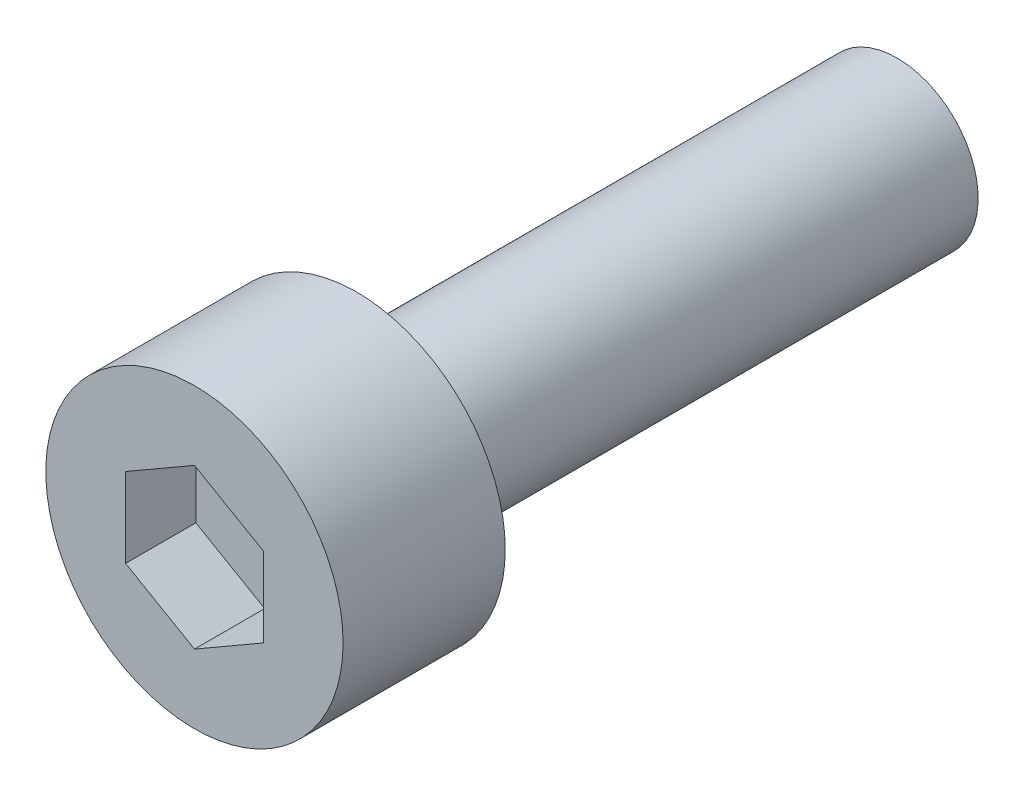
ISO-10303-21;
HEADER;
FILE_DESCRIPTION(('STEP AP214'),'2;1');
FILE_NAME('part.step','',(''),(''),'','','');
FILE_SCHEMA(('AUTOMOTIVE_DESIGN { 1 0 10303 214 1 1 1 1 }'));
ENDSEC;
DATA;
#1=APPLICATION_CONTEXT('core data for automotive mechanical design processes');
#2=APPLICATION_PROTOCOL_DEFINITION('international standard','automotive_design',2000,#1);
#3=PRODUCT_CONTEXT('',#1,'mechanical');
#4=PRODUCT('Part','Part','',(#3));
#5=PRODUCT_RELATED_PRODUCT_CATEGORY('part','',(#4));
#6=PRODUCT_DEFINITION_FORMATION('','',#4);
#7=PRODUCT_DEFINITION_CONTEXT('part definition',#1,'design');
#8=PRODUCT_DEFINITION('design','',#6,#7);
#9=PRODUCT_DEFINITION_SHAPE('','',#8);
#10=(LENGTH_UNIT() NAMED_UNIT(*) SI_UNIT(.MILLI.,.METRE.));
#11=(NAMED_UNIT(*) PLANE_ANGLE_UNIT() SI_UNIT($,.RADIAN.));
#12=(NAMED_UNIT(*) SI_UNIT($,.STERADIAN.) SOLID_ANGLE_UNIT());
#13=UNCERTAINTY_MEASURE_WITH_UNIT(LENGTH_MEASURE(1.E-05),#10,'distance_accuracy_value','');
#14=(GEOMETRIC_REPRESENTATION_CONTEXT(3) GLOBAL_UNCERTAINTY_ASSIGNED_CONTEXT((#13)) GLOBAL_UNIT_ASSIGNED_CONTEXT((#10,
#11,#12)) REPRESENTATION_CONTEXT('',''));
#15=CARTESIAN_POINT('',(0.,0.,0.));
#16=DIRECTION('',(0.,0.,1.));
#17=DIRECTION('',(1.,0.,0.));
#18=AXIS2_PLACEMENT_3D('',#15,#16,#17);
#19=CARTESIAN_POINT('',(0.,0.,3.));
#20=DIRECTION('',(0.,0.,-1.));
#21=DIRECTION('',(-1.,0.,0.));
#22=AXIS2_PLACEMENT_3D('',#19,#20,#21);
#23=CYLINDRICAL_SURFACE('',#22,2.75);
#24=CARTESIAN_POINT('',(0.,0.,3.));
#25=DIRECTION('',(0.,0.,1.));
#26=DIRECTION('',(1.,0.,0.));
#27=AXIS2_PLACEMENT_3D('',#24,#25,#26);
#28=CIRCLE('',#27,2.75);
#29=CARTESIAN_POINT('',(2.75,0.,3.));
#30=VERTEX_POINT('',#29);
#31=EDGE_CURVE('E48',#30,#30,#28,.T.);
#32=ORIENTED_EDGE('',*,*,#31,.F.);
#33=EDGE_LOOP('',(#32));
#34=FACE_BOUND('',#33,.T.);
#35=CARTESIAN_POINT('',(0.,0.,0.));
#36=DIRECTION('',(0.,0.,1.));
#37=DIRECTION('',(1.,0.,0.));
#38=AXIS2_PLACEMENT_3D('',#35,#36,#37);
#39=CIRCLE('',#38,2.75);
#40=CARTESIAN_POINT('',(2.75,0.,0.));
#41=VERTEX_POINT('',#40);
#42=EDGE_CURVE('E43',#41,#41,#39,.T.);
#43=ORIENTED_EDGE('',*,*,#42,.T.);
#44=EDGE_LOOP('',(#43));
#45=FACE_BOUND('',#44,.T.);
#46=ADVANCED_FACE('F40',(#34,#45),#23,.T.);
#47=CARTESIAN_POINT('',(0.,0.,3.));
#48=DIRECTION('',(0.,0.,1.));
#49=DIRECTION('',(1.,0.,0.));
#50=AXIS2_PLACEMENT_3D('',#47,#48,#49);
#51=PLANE('',#50);
#52=DIRECTION('',(0.866025403784439,0.5,0.));
#53=VECTOR('',#52,1.);
#54=CARTESIAN_POINT('',(0.,-1.47224318643355,3.));
#55=LINE('',#54,#53);
#56=CARTESIAN_POINT('',(0.,-1.47224318643355,3.));
#57=VERTEX_POINT('',#56);
#58=CARTESIAN_POINT('',(1.275,-0.736121593216773,3.));
#59=VERTEX_POINT('',#58);
#60=EDGE_CURVE('E56',#57,#59,#55,.T.);
#61=ORIENTED_EDGE('',*,*,#60,.F.);
#62=DIRECTION('',(0.866025403784439,-0.5,0.));
#63=VECTOR('',#62,1.);
#64=CARTESIAN_POINT('',(-1.275,-0.736121593216773,3.));
#65=LINE('',#64,#63);
#66=CARTESIAN_POINT('',(-1.275,-0.736121593216773,3.));
#67=VERTEX_POINT('',#66);
#68=EDGE_CURVE('E140',#67,#57,#65,.T.);
#69=ORIENTED_EDGE('',*,*,#68,.F.);
#70=DIRECTION('',(0.,-1.,0.));
#71=VECTOR('',#70,1.);
#72=CARTESIAN_POINT('',(-1.275,0.736121593216774,3.));
#73=LINE('',#72,#71);
#74=CARTESIAN_POINT('',(-1.275,0.736121593216774,3.));
#75=VERTEX_POINT('',#74);
#76=EDGE_CURVE('E138',#75,#67,#73,.T.);
#77=ORIENTED_EDGE('',*,*,#76,.F.);
#78=DIRECTION('',(-0.866025403784439,-0.5,0.));
#79=VECTOR('',#78,1.);
#80=CARTESIAN_POINT('',(0.,1.47224318643355,3.));
#81=LINE('',#80,#79);
#82=CARTESIAN_POINT('',(0.,1.47224318643355,3.));
#83=VERTEX_POINT('',#82);
#84=EDGE_CURVE('E104',#83,#75,#81,.T.);
#85=ORIENTED_EDGE('',*,*,#84,.F.);
#86=DIRECTION('',(-0.866025403784439,0.5,0.));
#87=VECTOR('',#86,1.);
#88=CARTESIAN_POINT('',(1.275,0.736121593216773,3.));
#89=LINE('',#88,#87);
#90=CARTESIAN_POINT('',(1.275,0.736121593216773,3.));
#91=VERTEX_POINT('',#90);
#92=EDGE_CURVE('E134',#91,#83,#89,.T.);
#93=ORIENTED_EDGE('',*,*,#92,.F.);
#94=DIRECTION('',(0.,1.,0.));
#95=VECTOR('',#94,1.);
#96=CARTESIAN_POINT('',(1.275,-0.736121593216773,3.));
#97=LINE('',#96,#95);
#98=EDGE_CURVE('E130',#59,#91,#97,.T.);
#99=ORIENTED_EDGE('',*,*,#98,.F.);
#100=EDGE_LOOP('',(#61,#69,#77,#85,#93,#99));
#101=FACE_BOUND('',#100,.T.);
#102=ORIENTED_EDGE('',*,*,#31,.T.);
#103=EDGE_LOOP('',(#102));
#104=FACE_BOUND('',#103,.T.);
#105=ADVANCED_FACE('F158',(#101,#104),#51,.T.);
#106=CARTESIAN_POINT('',(0.,0.,0.));
#107=DIRECTION('',(0.,0.,1.));
#108=DIRECTION('',(1.,0.,0.));
#109=AXIS2_PLACEMENT_3D('',#106,#107,#108);
#110=PLANE('',#109);
#111=CARTESIAN_POINT('',(0.,0.,0.));
#112=DIRECTION('',(0.,0.,-1.));
#113=DIRECTION('',(-1.,0.,0.));
#114=AXIS2_PLACEMENT_3D('',#111,#112,#113);
#115=CIRCLE('',#114,1.5);
#116=CARTESIAN_POINT('',(-1.5,0.,0.));
#117=VERTEX_POINT('',#116);
#118=EDGE_CURVE('E11',#117,#117,#115,.T.);
#119=ORIENTED_EDGE('',*,*,#118,.F.);
#120=EDGE_LOOP('',(#119));
#121=FACE_BOUND('',#120,.T.);
#122=ORIENTED_EDGE('',*,*,#42,.F.);
#123=EDGE_LOOP('',(#122));
#124=FACE_BOUND('',#123,.T.);
#125=ADVANCED_FACE('F155',(#121,#124),#110,.F.);
#126=CARTESIAN_POINT('',(0.,-1.47224318643355,1.7));
#127=DIRECTION('',(0.5,-0.866025403784439,0.));
#128=DIRECTION('',(0.866025403784439,0.5,0.));
#129=AXIS2_PLACEMENT_3D('',#126,#127,#128);
#130=PLANE('',#129);
#131=ORIENTED_EDGE('',*,*,#60,.T.);
#132=DIRECTION('',(0.,0.,1.));
#133=VECTOR('',#132,1.);
#134=CARTESIAN_POINT('',(1.275,-0.736121593216773,1.7));
#135=LINE('',#134,#133);
#136=CARTESIAN_POINT('',(1.275,-0.736121593216773,1.7));
#137=VERTEX_POINT('',#136);
#138=EDGE_CURVE('E86',#137,#59,#135,.T.);
#139=ORIENTED_EDGE('',*,*,#138,.F.);
#140=DIRECTION('',(0.866025403784439,0.5,0.));
#141=VECTOR('',#140,1.);
#142=CARTESIAN_POINT('',(0.,-1.47224318643355,1.7));
#143=LINE('',#142,#141);
#144=CARTESIAN_POINT('',(0.,-1.47224318643355,1.7));
#145=VERTEX_POINT('',#144);
#146=EDGE_CURVE('E142',#145,#137,#143,.T.);
#147=ORIENTED_EDGE('',*,*,#146,.F.);
#148=DIRECTION('',(0.,0.,1.));
#149=VECTOR('',#148,1.);
#150=CARTESIAN_POINT('',(0.,-1.47224318643355,1.7));
#151=LINE('',#150,#149);
#152=EDGE_CURVE('E64',#145,#57,#151,.T.);
#153=ORIENTED_EDGE('',*,*,#152,.T.);
#154=EDGE_LOOP('',(#131,#139,#147,#153));
#155=FACE_BOUND('',#154,.T.);
#156=ADVANCED_FACE('F157',(#155),#130,.F.);
#157=CARTESIAN_POINT('',(-1.275,-0.736121593216773,1.7));
#158=DIRECTION('',(-0.5,-0.866025403784439,0.));
#159=DIRECTION('',(0.866025403784439,-0.5,0.));
#160=AXIS2_PLACEMENT_3D('',#157,#158,#159);
#161=PLANE('',#160);
#162=ORIENTED_EDGE('',*,*,#68,.T.);
#163=ORIENTED_EDGE('',*,*,#152,.F.);
#164=DIRECTION('',(0.866025403784439,-0.5,0.));
#165=VECTOR('',#164,1.);
#166=CARTESIAN_POINT('',(-1.275,-0.736121593216773,1.7));
#167=LINE('',#166,#165);
#168=CARTESIAN_POINT('',(-1.275,-0.736121593216773,1.7));
#169=VERTEX_POINT('',#168);
#170=EDGE_CURVE('E116',#169,#145,#167,.T.);
#171=ORIENTED_EDGE('',*,*,#170,.F.);
#172=DIRECTION('',(0.,0.,1.));
#173=VECTOR('',#172,1.);
#174=CARTESIAN_POINT('',(-1.275,-0.736121593216773,1.7));
#175=LINE('',#174,#173);
#176=EDGE_CURVE('E108',#169,#67,#175,.T.);
#177=ORIENTED_EDGE('',*,*,#176,.T.);
#178=EDGE_LOOP('',(#162,#163,#171,#177));
#179=FACE_BOUND('',#178,.T.);
#180=ADVANCED_FACE('F164',(#179),#161,.F.);
#181=CARTESIAN_POINT('',(-1.275,0.736121593216774,1.7));
#182=DIRECTION('',(-1.,0.,0.));
#183=DIRECTION('',(0.,0.,1.));
#184=AXIS2_PLACEMENT_3D('',#181,#182,#183);
#185=PLANE('',#184);
#186=ORIENTED_EDGE('',*,*,#76,.T.);
#187=ORIENTED_EDGE('',*,*,#176,.F.);
#188=DIRECTION('',(0.,-1.,0.));
#189=VECTOR('',#188,1.);
#190=CARTESIAN_POINT('',(-1.275,0.736121593216774,1.7));
#191=LINE('',#190,#189);
#192=CARTESIAN_POINT('',(-1.275,0.736121593216774,1.7));
#193=VERTEX_POINT('',#192);
#194=EDGE_CURVE('E112',#193,#169,#191,.T.);
#195=ORIENTED_EDGE('',*,*,#194,.F.);
#196=DIRECTION('',(0.,0.,1.));
#197=VECTOR('',#196,1.);
#198=CARTESIAN_POINT('',(-1.275,0.736121593216774,1.7));
#199=LINE('',#198,#197);
#200=EDGE_CURVE('E97',#193,#75,#199,.T.);
#201=ORIENTED_EDGE('',*,*,#200,.T.);
#202=EDGE_LOOP('',(#186,#187,#195,#201));
#203=FACE_BOUND('',#202,.T.);
#204=ADVANCED_FACE('F113',(#203),#185,.F.);
#205=CARTESIAN_POINT('',(0.,1.47224318643355,1.7));
#206=DIRECTION('',(-0.5,0.866025403784439,0.));
#207=DIRECTION('',(-0.866025403784439,-0.5,0.));
#208=AXIS2_PLACEMENT_3D('',#205,#206,#207);
#209=PLANE('',#208);
#210=ORIENTED_EDGE('',*,*,#84,.T.);
#211=ORIENTED_EDGE('',*,*,#200,.F.);
#212=DIRECTION('',(-0.866025403784439,-0.5,0.));
#213=VECTOR('',#212,1.);
#214=CARTESIAN_POINT('',(0.,1.47224318643355,1.7));
#215=LINE('',#214,#213);
#216=CARTESIAN_POINT('',(0.,1.47224318643355,1.7));
#217=VERTEX_POINT('',#216);
#218=EDGE_CURVE('E101',#217,#193,#215,.T.);
#219=ORIENTED_EDGE('',*,*,#218,.F.);
#220=DIRECTION('',(0.,0.,1.));
#221=VECTOR('',#220,1.);
#222=CARTESIAN_POINT('',(0.,1.47224318643355,1.7));
#223=LINE('',#222,#221);
#224=EDGE_CURVE('E109',#217,#83,#223,.T.);
#225=ORIENTED_EDGE('',*,*,#224,.T.);
#226=EDGE_LOOP('',(#210,#211,#219,#225));
#227=FACE_BOUND('',#226,.T.);
#228=ADVANCED_FACE('F99',(#227),#209,.F.);
#229=CARTESIAN_POINT('',(1.275,0.736121593216773,1.7));
#230=DIRECTION('',(0.5,0.866025403784439,0.));
#231=DIRECTION('',(-0.866025403784439,0.5,0.));
#232=AXIS2_PLACEMENT_3D('',#229,#230,#231);
#233=PLANE('',#232);
#234=ORIENTED_EDGE('',*,*,#92,.T.);
#235=ORIENTED_EDGE('',*,*,#224,.F.);
#236=DIRECTION('',(-0.866025403784439,0.5,0.));
#237=VECTOR('',#236,1.);
#238=CARTESIAN_POINT('',(1.275,0.736121593216773,1.7));
#239=LINE('',#238,#237);
#240=CARTESIAN_POINT('',(1.275,0.736121593216773,1.7));
#241=VERTEX_POINT('',#240);
#242=EDGE_CURVE('E122',#241,#217,#239,.T.);
#243=ORIENTED_EDGE('',*,*,#242,.F.);
#244=DIRECTION('',(0.,0.,1.));
#245=VECTOR('',#244,1.);
#246=CARTESIAN_POINT('',(1.275,0.736121593216773,1.7));
#247=LINE('',#246,#245);
#248=EDGE_CURVE('E146',#241,#91,#247,.T.);
#249=ORIENTED_EDGE('',*,*,#248,.T.);
#250=EDGE_LOOP('',(#234,#235,#243,#249));
#251=FACE_BOUND('',#250,.T.);
#252=ADVANCED_FACE('F209',(#251),#233,.F.);
#253=CARTESIAN_POINT('',(1.275,-0.736121593216773,1.7));
#254=DIRECTION('',(1.,0.,0.));
#255=DIRECTION('',(0.,0.,-1.));
#256=AXIS2_PLACEMENT_3D('',#253,#254,#255);
#257=PLANE('',#256);
#258=ORIENTED_EDGE('',*,*,#98,.T.);
#259=ORIENTED_EDGE('',*,*,#248,.F.);
#260=DIRECTION('',(0.,1.,0.));
#261=VECTOR('',#260,1.);
#262=CARTESIAN_POINT('',(1.275,-0.736121593216773,1.7));
#263=LINE('',#262,#261);
#264=EDGE_CURVE('E124',#137,#241,#263,.T.);
#265=ORIENTED_EDGE('',*,*,#264,.F.);
#266=ORIENTED_EDGE('',*,*,#138,.T.);
#267=EDGE_LOOP('',(#258,#259,#265,#266));
#268=FACE_BOUND('',#267,.T.);
#269=ADVANCED_FACE('F218',(#268),#257,.F.);
#270=CARTESIAN_POINT('',(0.,0.,1.7));
#271=DIRECTION('',(0.,0.,1.));
#272=DIRECTION('',(1.,0.,0.));
#273=AXIS2_PLACEMENT_3D('',#270,#271,#272);
#274=PLANE('',#273);
#275=ORIENTED_EDGE('',*,*,#146,.T.);
#276=ORIENTED_EDGE('',*,*,#264,.T.);
#277=ORIENTED_EDGE('',*,*,#242,.T.);
#278=ORIENTED_EDGE('',*,*,#218,.T.);
#279=ORIENTED_EDGE('',*,*,#194,.T.);
#280=ORIENTED_EDGE('',*,*,#170,.T.);
#281=EDGE_LOOP('',(#275,#276,#277,#278,#279,#280));
#282=FACE_BOUND('',#281,.T.);
#283=ADVANCED_FACE('F119',(#282),#274,.T.);
#284=CARTESIAN_POINT('',(0.,0.,-10.));
#285=DIRECTION('',(0.,0.,1.));
#286=DIRECTION('',(1.,0.,0.));
#287=AXIS2_PLACEMENT_3D('',#284,#285,#286);
#288=CYLINDRICAL_SURFACE('',#287,1.5);
#289=CARTESIAN_POINT('',(0.,0.,-10.));
#290=DIRECTION('',(0.,0.,-1.));
#291=DIRECTION('',(-1.,0.,0.));
#292=AXIS2_PLACEMENT_3D('',#289,#290,#291);
#293=CIRCLE('',#292,1.5);
#294=CARTESIAN_POINT('',(-1.5,0.,-10.));
#295=VERTEX_POINT('',#294);
#296=EDGE_CURVE('E131',#295,#295,#293,.T.);
#297=ORIENTED_EDGE('',*,*,#296,.F.);
#298=EDGE_LOOP('',(#297));
#299=FACE_BOUND('',#298,.T.);
#300=ORIENTED_EDGE('',*,*,#118,.T.);
#301=EDGE_LOOP('',(#300));
#302=FACE_BOUND('',#301,.T.);
#303=ADVANCED_FACE('F236',(#299,#302),#288,.T.);
#304=CARTESIAN_POINT('',(0.,0.,-10.));
#305=DIRECTION('',(0.,0.,-1.));
#306=DIRECTION('',(-1.,0.,0.));
#307=AXIS2_PLACEMENT_3D('',#304,#305,#306);
#308=PLANE('',#307);
#309=ORIENTED_EDGE('',*,*,#296,.T.);
#310=EDGE_LOOP('',(#309));
#311=FACE_BOUND('',#310,.T.);
#312=ADVANCED_FACE('F250',(#311),#308,.T.);
#313=CLOSED_SHELL('',(#46,#105,#125,#156,#180,#204,#228,#252,#269,#283,#303,#312));
#314=MANIFOLD_SOLID_BREP('B2',#313);
#315=ADVANCED_BREP_SHAPE_REPRESENTATION('',(#18,#314),#14);
#316=SHAPE_DEFINITION_REPRESENTATION(#9,#315);
ENDSEC;
END-ISO-10303-21;
